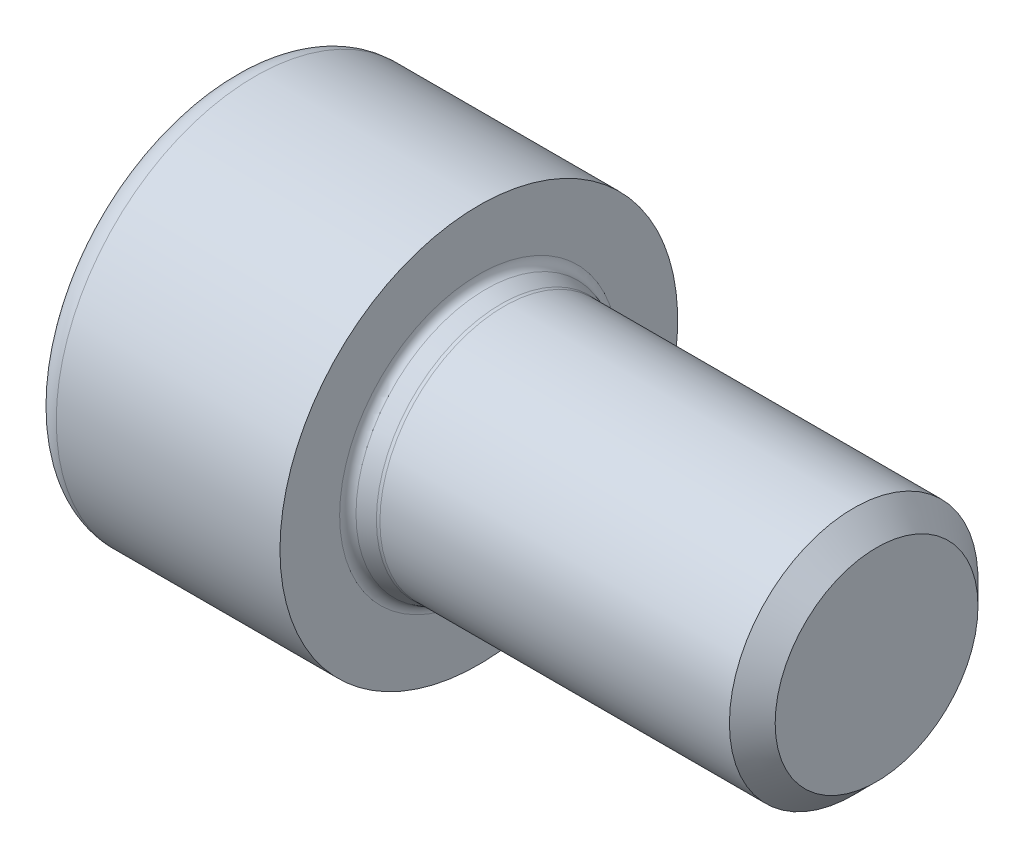
ISO-10303-21;
HEADER;
FILE_DESCRIPTION(('STEP AP214'),'2;1');
FILE_NAME('part.step','',(''),(''),'','','');
FILE_SCHEMA(('AUTOMOTIVE_DESIGN { 1 0 10303 214 1 1 1 1 }'));
ENDSEC;
DATA;
#1=APPLICATION_CONTEXT('core data for automotive mechanical design processes');
#2=APPLICATION_PROTOCOL_DEFINITION('international standard','automotive_design',2000,#1);
#3=PRODUCT_CONTEXT('',#1,'mechanical');
#4=PRODUCT('Part','Part','',(#3));
#5=PRODUCT_RELATED_PRODUCT_CATEGORY('part','',(#4));
#6=PRODUCT_DEFINITION_FORMATION('','',#4);
#7=PRODUCT_DEFINITION_CONTEXT('part definition',#1,'design');
#8=PRODUCT_DEFINITION('design','',#6,#7);
#9=PRODUCT_DEFINITION_SHAPE('','',#8);
#10=(LENGTH_UNIT() NAMED_UNIT(*) SI_UNIT(.MILLI.,.METRE.));
#11=(NAMED_UNIT(*) PLANE_ANGLE_UNIT() SI_UNIT($,.RADIAN.));
#12=(NAMED_UNIT(*) SI_UNIT($,.STERADIAN.) SOLID_ANGLE_UNIT());
#13=UNCERTAINTY_MEASURE_WITH_UNIT(LENGTH_MEASURE(1.E-05),#10,'distance_accuracy_value','');
#14=(GEOMETRIC_REPRESENTATION_CONTEXT(3) GLOBAL_UNCERTAINTY_ASSIGNED_CONTEXT((#13)) GLOBAL_UNIT_ASSIGNED_CONTEXT((#10,
#11,#12)) REPRESENTATION_CONTEXT('',''));
#15=CARTESIAN_POINT('',(0.,0.,0.));
#16=DIRECTION('',(0.,0.,1.));
#17=DIRECTION('',(1.,0.,0.));
#18=AXIS2_PLACEMENT_3D('',#15,#16,#17);
#19=CARTESIAN_POINT('',(-10.,4.,0.));
#20=DIRECTION('',(1.,0.,0.));
#21=DIRECTION('',(0.,0.,-1.));
#22=AXIS2_PLACEMENT_3D('',#19,#20,#21);
#23=PLANE('',#22);
#24=DIRECTION('',(0.,0.5,-0.866025403784439));
#25=VECTOR('',#24,1.);
#26=CARTESIAN_POINT('',(-10.,-2.46410161513776,-3.73205080756888));
#27=LINE('',#26,#25);
#28=CARTESIAN_POINT('',(-10.,-4.61880215351701,0.));
#29=VERTEX_POINT('',#28);
#30=CARTESIAN_POINT('',(-10.,-2.3094010767585,-4.));
#31=VERTEX_POINT('',#30);
#32=EDGE_CURVE('E250',#29,#31,#27,.T.);
#33=ORIENTED_EDGE('',*,*,#32,.T.);
#34=DIRECTION('',(0.,1.,0.));
#35=VECTOR('',#34,1.);
#36=CARTESIAN_POINT('',(-10.,4.,-4.));
#37=LINE('',#36,#35);
#38=CARTESIAN_POINT('',(-10.,2.3094010767585,-4.));
#39=VERTEX_POINT('',#38);
#40=EDGE_CURVE('E52',#31,#39,#37,.T.);
#41=ORIENTED_EDGE('',*,*,#40,.T.);
#42=DIRECTION('',(0.,0.5,0.866025403784439));
#43=VECTOR('',#42,1.);
#44=CARTESIAN_POINT('',(-10.,4.46410161513775,-0.267949192431123));
#45=LINE('',#44,#43);
#46=CARTESIAN_POINT('',(-10.,4.61880215351701,0.));
#47=VERTEX_POINT('',#46);
#48=EDGE_CURVE('E100',#39,#47,#45,.T.);
#49=ORIENTED_EDGE('',*,*,#48,.T.);
#50=DIRECTION('',(0.,-0.5,0.866025403784439));
#51=VECTOR('',#50,1.);
#52=CARTESIAN_POINT('',(-10.,4.46410161513775,0.267949192431123));
#53=LINE('',#52,#51);
#54=CARTESIAN_POINT('',(-10.,2.3094010767585,4.));
#55=VERTEX_POINT('',#54);
#56=EDGE_CURVE('E249',#47,#55,#53,.T.);
#57=ORIENTED_EDGE('',*,*,#56,.T.);
#58=DIRECTION('',(0.,-1.,0.));
#59=VECTOR('',#58,1.);
#60=CARTESIAN_POINT('',(-10.,4.,4.));
#61=LINE('',#60,#59);
#62=CARTESIAN_POINT('',(-10.,-2.3094010767585,4.));
#63=VERTEX_POINT('',#62);
#64=EDGE_CURVE('E182',#55,#63,#61,.T.);
#65=ORIENTED_EDGE('',*,*,#64,.T.);
#66=DIRECTION('',(0.,-0.5,-0.866025403784439));
#67=VECTOR('',#66,1.);
#68=CARTESIAN_POINT('',(-10.,-2.46410161513776,3.73205080756888));
#69=LINE('',#68,#67);
#70=EDGE_CURVE('E241',#63,#29,#69,.T.);
#71=ORIENTED_EDGE('',*,*,#70,.T.);
#72=EDGE_LOOP('',(#33,#41,#49,#57,#65,#71));
#73=FACE_BOUND('',#72,.T.);
#74=CARTESIAN_POINT('',(-10.,0.,0.));
#75=DIRECTION('',(-1.,0.,0.));
#76=DIRECTION('',(0.,0.,1.));
#77=AXIS2_PLACEMENT_3D('',#74,#75,#76);
#78=CIRCLE('',#77,6.99999999999999);
#79=CARTESIAN_POINT('',(-10.,0.,6.99999999999999));
#80=VERTEX_POINT('',#79);
#81=EDGE_CURVE('E240',#80,#80,#78,.T.);
#82=ORIENTED_EDGE('',*,*,#81,.T.);
#83=EDGE_LOOP('',(#82));
#84=FACE_BOUND('',#83,.T.);
#85=ADVANCED_FACE('F90',(#73,#84),#23,.F.);
#86=CARTESIAN_POINT('',(-8.99999999999999,0.,0.));
#87=DIRECTION('',(-1.,0.,0.));
#88=DIRECTION('',(0.,0.,1.));
#89=AXIS2_PLACEMENT_3D('',#86,#87,#88);
#90=TOROIDAL_SURFACE('',#89,6.99999999999999,1.00000000000001);
#91=ORIENTED_EDGE('',*,*,#81,.F.);
#92=EDGE_LOOP('',(#91));
#93=FACE_BOUND('',#92,.T.);
#94=CARTESIAN_POINT('',(-9.,0.,0.));
#95=DIRECTION('',(-1.,0.,0.));
#96=DIRECTION('',(0.,0.,1.));
#97=AXIS2_PLACEMENT_3D('',#94,#95,#96);
#98=CIRCLE('',#97,8.);
#99=CARTESIAN_POINT('',(-9.,0.,8.));
#100=VERTEX_POINT('',#99);
#101=EDGE_CURVE('E233',#100,#100,#98,.T.);
#102=ORIENTED_EDGE('',*,*,#101,.T.);
#103=EDGE_LOOP('',(#102));
#104=FACE_BOUND('',#103,.T.);
#105=ADVANCED_FACE('F302',(#93,#104),#90,.T.);
#106=CARTESIAN_POINT('',(16.,0.,0.));
#107=DIRECTION('',(-1.,0.,0.));
#108=DIRECTION('',(0.,0.,1.));
#109=AXIS2_PLACEMENT_3D('',#106,#107,#108);
#110=CYLINDRICAL_SURFACE('',#109,8.);
#111=ORIENTED_EDGE('',*,*,#101,.F.);
#112=EDGE_LOOP('',(#111));
#113=FACE_BOUND('',#112,.T.);
#114=CARTESIAN_POINT('',(0.,0.,0.));
#115=DIRECTION('',(-1.,0.,0.));
#116=DIRECTION('',(0.,0.,1.));
#117=AXIS2_PLACEMENT_3D('',#114,#115,#116);
#118=CIRCLE('',#117,8.);
#119=CARTESIAN_POINT('',(0.,0.,8.));
#120=VERTEX_POINT('',#119);
#121=EDGE_CURVE('E234',#120,#120,#118,.T.);
#122=ORIENTED_EDGE('',*,*,#121,.T.);
#123=EDGE_LOOP('',(#122));
#124=FACE_BOUND('',#123,.T.);
#125=ADVANCED_FACE('F313',(#113,#124),#110,.T.);
#126=CARTESIAN_POINT('',(0.,8.,0.));
#127=DIRECTION('',(-1.,0.,0.));
#128=DIRECTION('',(0.,0.,1.));
#129=AXIS2_PLACEMENT_3D('',#126,#127,#128);
#130=PLANE('',#129);
#131=ORIENTED_EDGE('',*,*,#121,.F.);
#132=EDGE_LOOP('',(#131));
#133=FACE_BOUND('',#132,.T.);
#134=CARTESIAN_POINT('',(0.,0.,0.));
#135=DIRECTION('',(-1.,0.,0.));
#136=DIRECTION('',(0.,0.,1.));
#137=AXIS2_PLACEMENT_3D('',#134,#135,#136);
#138=CIRCLE('',#137,5.6);
#139=CARTESIAN_POINT('',(0.,0.,5.6));
#140=VERTEX_POINT('',#139);
#141=EDGE_CURVE('E229',#140,#140,#138,.T.);
#142=ORIENTED_EDGE('',*,*,#141,.T.);
#143=EDGE_LOOP('',(#142));
#144=FACE_BOUND('',#143,.T.);
#145=ADVANCED_FACE('F320',(#133,#144),#130,.F.);
#146=CARTESIAN_POINT('',(0.399999999999996,0.,0.));
#147=DIRECTION('',(-1.,0.,0.));
#148=DIRECTION('',(0.,0.,1.));
#149=AXIS2_PLACEMENT_3D('',#146,#147,#148);
#150=TOROIDAL_SURFACE('',#149,5.6,0.399999999999996);
#151=ORIENTED_EDGE('',*,*,#141,.F.);
#152=EDGE_LOOP('',(#151));
#153=FACE_BOUND('',#152,.T.);
#154=CARTESIAN_POINT('',(0.277198888030895,0.,0.));
#155=DIRECTION('',(-1.,0.,0.));
#156=DIRECTION('',(0.,0.,1.));
#157=AXIS2_PLACEMENT_3D('',#154,#155,#156);
#158=CIRCLE('',#157,5.21931655289578);
#159=CARTESIAN_POINT('',(0.277198888030895,0.,5.21931655289578));
#160=VERTEX_POINT('',#159);
#161=EDGE_CURVE('E223',#160,#160,#158,.T.);
#162=ORIENTED_EDGE('',*,*,#161,.T.);
#163=EDGE_LOOP('',(#162));
#164=FACE_BOUND('',#163,.T.);
#165=ADVANCED_FACE('F319',(#153,#164),#150,.F.);
#166=CARTESIAN_POINT('',(0.897198888030895,0.,0.));
#167=DIRECTION('',(-1.,0.,0.));
#168=DIRECTION('',(0.,0.,1.));
#169=AXIS2_PLACEMENT_3D('',#166,#167,#168);
#170=CONICAL_SURFACE('',#169,5.01931655289578,0.312042121562535);
#171=ORIENTED_EDGE('',*,*,#161,.F.);
#172=EDGE_LOOP('',(#171));
#173=FACE_BOUND('',#172,.T.);
#174=CARTESIAN_POINT('',(0.897198888030895,0.,0.));
#175=DIRECTION('',(-1.,0.,0.));
#176=DIRECTION('',(0.,0.,1.));
#177=AXIS2_PLACEMENT_3D('',#174,#175,#176);
#178=CIRCLE('',#177,5.01931655289578);
#179=CARTESIAN_POINT('',(0.897198888030895,0.,5.01931655289578));
#180=VERTEX_POINT('',#179);
#181=EDGE_CURVE('E225',#180,#180,#178,.T.);
#182=ORIENTED_EDGE('',*,*,#181,.T.);
#183=EDGE_LOOP('',(#182));
#184=FACE_BOUND('',#183,.T.);
#185=ADVANCED_FACE('F322',(#173,#184),#170,.T.);
#186=CARTESIAN_POINT('',(1.01999999999999,0.,0.));
#187=DIRECTION('',(-1.,0.,0.));
#188=DIRECTION('',(0.,0.,1.));
#189=AXIS2_PLACEMENT_3D('',#186,#187,#188);
#190=TOROIDAL_SURFACE('',#189,5.39999999999996,0.399999999999959);
#191=ORIENTED_EDGE('',*,*,#181,.F.);
#192=EDGE_LOOP('',(#191));
#193=FACE_BOUND('',#192,.T.);
#194=CARTESIAN_POINT('',(1.02,0.,0.));
#195=DIRECTION('',(-1.,0.,0.));
#196=DIRECTION('',(0.,0.,1.));
#197=AXIS2_PLACEMENT_3D('',#194,#195,#196);
#198=CIRCLE('',#197,5.);
#199=CARTESIAN_POINT('',(1.02,0.,5.));
#200=VERTEX_POINT('',#199);
#201=EDGE_CURVE('E218',#200,#200,#198,.T.);
#202=ORIENTED_EDGE('',*,*,#201,.T.);
#203=EDGE_LOOP('',(#202));
#204=FACE_BOUND('',#203,.T.);
#205=ADVANCED_FACE('F327',(#193,#204),#190,.F.);
#206=CARTESIAN_POINT('',(16.,0.,0.));
#207=DIRECTION('',(-1.,0.,0.));
#208=DIRECTION('',(0.,0.,1.));
#209=AXIS2_PLACEMENT_3D('',#206,#207,#208);
#210=CYLINDRICAL_SURFACE('',#209,5.);
#211=ORIENTED_EDGE('',*,*,#201,.F.);
#212=EDGE_LOOP('',(#211));
#213=FACE_BOUND('',#212,.T.);
#214=CARTESIAN_POINT('',(15.08,0.,0.));
#215=DIRECTION('',(-1.,0.,0.));
#216=DIRECTION('',(0.,0.,1.));
#217=AXIS2_PLACEMENT_3D('',#214,#215,#216);
#218=CIRCLE('',#217,5.);
#219=CARTESIAN_POINT('',(15.08,0.,5.));
#220=VERTEX_POINT('',#219);
#221=EDGE_CURVE('E216',#220,#220,#218,.T.);
#222=ORIENTED_EDGE('',*,*,#221,.T.);
#223=EDGE_LOOP('',(#222));
#224=FACE_BOUND('',#223,.T.);
#225=ADVANCED_FACE('F332',(#213,#224),#210,.T.);
#226=CARTESIAN_POINT('',(16.,0.,0.));
#227=DIRECTION('',(-1.,0.,0.));
#228=DIRECTION('',(0.,0.,1.));
#229=AXIS2_PLACEMENT_3D('',#226,#227,#228);
#230=CONICAL_SURFACE('',#229,4.08,0.785398163397448);
#231=ORIENTED_EDGE('',*,*,#221,.F.);
#232=EDGE_LOOP('',(#231));
#233=FACE_BOUND('',#232,.T.);
#234=CARTESIAN_POINT('',(16.,0.,0.));
#235=DIRECTION('',(-1.,0.,0.));
#236=DIRECTION('',(0.,0.,1.));
#237=AXIS2_PLACEMENT_3D('',#234,#235,#236);
#238=CIRCLE('',#237,4.08);
#239=CARTESIAN_POINT('',(16.,0.,4.08));
#240=VERTEX_POINT('',#239);
#241=EDGE_CURVE('E206',#240,#240,#238,.T.);
#242=ORIENTED_EDGE('',*,*,#241,.T.);
#243=EDGE_LOOP('',(#242));
#244=FACE_BOUND('',#243,.T.);
#245=ADVANCED_FACE('F299',(#233,#244),#230,.T.);
#246=CARTESIAN_POINT('',(16.,4.08,0.));
#247=DIRECTION('',(-1.,0.,0.));
#248=DIRECTION('',(0.,0.,1.));
#249=AXIS2_PLACEMENT_3D('',#246,#247,#248);
#250=PLANE('',#249);
#251=ORIENTED_EDGE('',*,*,#241,.F.);
#252=EDGE_LOOP('',(#251));
#253=FACE_BOUND('',#252,.T.);
#254=ADVANCED_FACE('F295',(#253),#250,.F.);
#255=CARTESIAN_POINT('',(-4.,0.,0.));
#256=DIRECTION('',(1.,0.,0.));
#257=DIRECTION('',(0.,0.,-1.));
#258=AXIS2_PLACEMENT_3D('',#255,#256,#257);
#259=PLANE('',#258);
#260=DIRECTION('',(0.,1.,0.));
#261=VECTOR('',#260,1.);
#262=CARTESIAN_POINT('',(-4.,-2.3094010767585,-4.));
#263=LINE('',#262,#261);
#264=CARTESIAN_POINT('',(-4.,-2.3094010767585,-4.));
#265=VERTEX_POINT('',#264);
#266=CARTESIAN_POINT('',(-4.,0.,-4.));
#267=VERTEX_POINT('',#266);
#268=EDGE_CURVE('E102',#265,#267,#263,.T.);
#269=ORIENTED_EDGE('',*,*,#268,.F.);
#270=DIRECTION('',(0.,0.5,-0.866025403784439));
#271=VECTOR('',#270,1.);
#272=CARTESIAN_POINT('',(-4.,-4.61880215351701,0.));
#273=LINE('',#272,#271);
#274=CARTESIAN_POINT('',(-4.,-3.46410161513775,-2.));
#275=VERTEX_POINT('',#274);
#276=EDGE_CURVE('E192',#275,#265,#273,.T.);
#277=ORIENTED_EDGE('',*,*,#276,.F.);
#278=CARTESIAN_POINT('',(-4.,0.,0.));
#279=DIRECTION('',(-1.,0.,0.));
#280=DIRECTION('',(0.,0.,1.));
#281=AXIS2_PLACEMENT_3D('',#278,#279,#280);
#282=CIRCLE('',#281,4.);
#283=EDGE_CURVE('E269',#267,#275,#282,.T.);
#284=ORIENTED_EDGE('',*,*,#283,.F.);
#285=EDGE_LOOP('',(#269,#277,#284));
#286=FACE_BOUND('',#285,.T.);
#287=ADVANCED_FACE('F287',(#286),#259,.F.);
#288=CARTESIAN_POINT('',(-4.,-4.61880215351701,0.));
#289=VERTEX_POINT('',#288);
#290=EDGE_CURVE('E198',#289,#275,#273,.T.);
#291=ORIENTED_EDGE('',*,*,#290,.F.);
#292=DIRECTION('',(0.,-0.5,-0.866025403784439));
#293=VECTOR('',#292,1.);
#294=CARTESIAN_POINT('',(-4.,-2.3094010767585,4.));
#295=LINE('',#294,#293);
#296=CARTESIAN_POINT('',(-4.,-3.46410161513775,2.));
#297=VERTEX_POINT('',#296);
#298=EDGE_CURVE('E190',#297,#289,#295,.T.);
#299=ORIENTED_EDGE('',*,*,#298,.F.);
#300=EDGE_CURVE('E271',#275,#297,#282,.T.);
#301=ORIENTED_EDGE('',*,*,#300,.F.);
#302=EDGE_LOOP('',(#291,#299,#301));
#303=FACE_BOUND('',#302,.T.);
#304=ADVANCED_FACE('F276',(#303),#259,.F.);
#305=CARTESIAN_POINT('',(-4.,-2.3094010767585,4.));
#306=VERTEX_POINT('',#305);
#307=EDGE_CURVE('E194',#306,#297,#295,.T.);
#308=ORIENTED_EDGE('',*,*,#307,.F.);
#309=DIRECTION('',(0.,-1.,0.));
#310=VECTOR('',#309,1.);
#311=CARTESIAN_POINT('',(-4.,2.3094010767585,4.));
#312=LINE('',#311,#310);
#313=CARTESIAN_POINT('',(-4.,0.,4.));
#314=VERTEX_POINT('',#313);
#315=EDGE_CURVE('E189',#314,#306,#312,.T.);
#316=ORIENTED_EDGE('',*,*,#315,.F.);
#317=EDGE_CURVE('E238',#297,#314,#282,.T.);
#318=ORIENTED_EDGE('',*,*,#317,.F.);
#319=EDGE_LOOP('',(#308,#316,#318));
#320=FACE_BOUND('',#319,.T.);
#321=ADVANCED_FACE('F277',(#320),#259,.F.);
#322=CARTESIAN_POINT('',(-4.,2.3094010767585,4.));
#323=VERTEX_POINT('',#322);
#324=EDGE_CURVE('E180',#323,#314,#312,.T.);
#325=ORIENTED_EDGE('',*,*,#324,.F.);
#326=DIRECTION('',(0.,-0.5,0.866025403784439));
#327=VECTOR('',#326,1.);
#328=CARTESIAN_POINT('',(-4.,4.61880215351701,0.));
#329=LINE('',#328,#327);
#330=CARTESIAN_POINT('',(-4.,3.46410161513775,2.));
#331=VERTEX_POINT('',#330);
#332=EDGE_CURVE('E164',#331,#323,#329,.T.);
#333=ORIENTED_EDGE('',*,*,#332,.F.);
#334=EDGE_CURVE('E183',#314,#331,#282,.T.);
#335=ORIENTED_EDGE('',*,*,#334,.F.);
#336=EDGE_LOOP('',(#325,#333,#335));
#337=FACE_BOUND('',#336,.T.);
#338=ADVANCED_FACE('F184',(#337),#259,.F.);
#339=CARTESIAN_POINT('',(-4.,4.61880215351701,0.));
#340=VERTEX_POINT('',#339);
#341=EDGE_CURVE('E172',#340,#331,#329,.T.);
#342=ORIENTED_EDGE('',*,*,#341,.F.);
#343=DIRECTION('',(0.,0.5,0.866025403784439));
#344=VECTOR('',#343,1.);
#345=CARTESIAN_POINT('',(-4.,2.3094010767585,-4.));
#346=LINE('',#345,#344);
#347=CARTESIAN_POINT('',(-4.,3.46410161513775,-2.));
#348=VERTEX_POINT('',#347);
#349=EDGE_CURVE('E203',#348,#340,#346,.T.);
#350=ORIENTED_EDGE('',*,*,#349,.F.);
#351=EDGE_CURVE('E245',#331,#348,#282,.T.);
#352=ORIENTED_EDGE('',*,*,#351,.F.);
#353=EDGE_LOOP('',(#342,#350,#352));
#354=FACE_BOUND('',#353,.T.);
#355=ADVANCED_FACE('F305',(#354),#259,.F.);
#356=CARTESIAN_POINT('',(-4.,2.3094010767585,-4.));
#357=VERTEX_POINT('',#356);
#358=EDGE_CURVE('E185',#357,#348,#346,.T.);
#359=ORIENTED_EDGE('',*,*,#358,.F.);
#360=EDGE_CURVE('E200',#267,#357,#263,.T.);
#361=ORIENTED_EDGE('',*,*,#360,.F.);
#362=EDGE_CURVE('E262',#348,#267,#282,.T.);
#363=ORIENTED_EDGE('',*,*,#362,.F.);
#364=EDGE_LOOP('',(#359,#361,#363));
#365=FACE_BOUND('',#364,.T.);
#366=ADVANCED_FACE('F265',(#365),#259,.F.);
#367=CARTESIAN_POINT('',(-14.,4.61880215351701,0.));
#368=DIRECTION('',(0.,0.866025403784439,0.5));
#369=DIRECTION('',(0.,-0.5,0.866025403784439));
#370=AXIS2_PLACEMENT_3D('',#367,#368,#369);
#371=PLANE('',#370);
#372=ORIENTED_EDGE('',*,*,#56,.F.);
#373=DIRECTION('',(1.,0.,0.));
#374=VECTOR('',#373,1.);
#375=CARTESIAN_POINT('',(-14.,4.61880215351701,0.));
#376=LINE('',#375,#374);
#377=EDGE_CURVE('E204',#47,#340,#376,.T.);
#378=ORIENTED_EDGE('',*,*,#377,.T.);
#379=ORIENTED_EDGE('',*,*,#341,.T.);
#380=ORIENTED_EDGE('',*,*,#332,.T.);
#381=DIRECTION('',(1.,0.,0.));
#382=VECTOR('',#381,1.);
#383=CARTESIAN_POINT('',(-14.,2.3094010767585,4.));
#384=LINE('',#383,#382);
#385=EDGE_CURVE('E169',#55,#323,#384,.T.);
#386=ORIENTED_EDGE('',*,*,#385,.F.);
#387=EDGE_LOOP('',(#372,#378,#379,#380,#386));
#388=FACE_BOUND('',#387,.T.);
#389=ADVANCED_FACE('F170',(#388),#371,.F.);
#390=CARTESIAN_POINT('',(-14.,2.3094010767585,-4.));
#391=DIRECTION('',(0.,0.866025403784439,-0.5));
#392=DIRECTION('',(0.,0.5,0.866025403784439));
#393=AXIS2_PLACEMENT_3D('',#390,#391,#392);
#394=PLANE('',#393);
#395=ORIENTED_EDGE('',*,*,#48,.F.);
#396=DIRECTION('',(1.,0.,0.));
#397=VECTOR('',#396,1.);
#398=CARTESIAN_POINT('',(-14.,2.3094010767585,-4.));
#399=LINE('',#398,#397);
#400=EDGE_CURVE('E210',#39,#357,#399,.T.);
#401=ORIENTED_EDGE('',*,*,#400,.T.);
#402=ORIENTED_EDGE('',*,*,#358,.T.);
#403=ORIENTED_EDGE('',*,*,#349,.T.);
#404=ORIENTED_EDGE('',*,*,#377,.F.);
#405=EDGE_LOOP('',(#395,#401,#402,#403,#404));
#406=FACE_BOUND('',#405,.T.);
#407=ADVANCED_FACE('F258',(#406),#394,.F.);
#408=CARTESIAN_POINT('',(-14.,-2.3094010767585,-4.));
#409=DIRECTION('',(0.,0.,-1.));
#410=DIRECTION('',(-1.,0.,0.));
#411=AXIS2_PLACEMENT_3D('',#408,#409,#410);
#412=PLANE('',#411);
#413=ORIENTED_EDGE('',*,*,#40,.F.);
#414=DIRECTION('',(1.,0.,0.));
#415=VECTOR('',#414,1.);
#416=CARTESIAN_POINT('',(-14.,-2.3094010767585,-4.));
#417=LINE('',#416,#415);
#418=EDGE_CURVE('E207',#31,#265,#417,.T.);
#419=ORIENTED_EDGE('',*,*,#418,.T.);
#420=ORIENTED_EDGE('',*,*,#268,.T.);
#421=ORIENTED_EDGE('',*,*,#360,.T.);
#422=ORIENTED_EDGE('',*,*,#400,.F.);
#423=EDGE_LOOP('',(#413,#419,#420,#421,#422));
#424=FACE_BOUND('',#423,.T.);
#425=ADVANCED_FACE('F256',(#424),#412,.F.);
#426=CARTESIAN_POINT('',(-14.,-4.61880215351701,0.));
#427=DIRECTION('',(0.,-0.866025403784439,-0.5));
#428=DIRECTION('',(0.,0.5,-0.866025403784439));
#429=AXIS2_PLACEMENT_3D('',#426,#427,#428);
#430=PLANE('',#429);
#431=ORIENTED_EDGE('',*,*,#32,.F.);
#432=DIRECTION('',(1.,0.,0.));
#433=VECTOR('',#432,1.);
#434=CARTESIAN_POINT('',(-14.,-4.61880215351701,0.));
#435=LINE('',#434,#433);
#436=EDGE_CURVE('E211',#29,#289,#435,.T.);
#437=ORIENTED_EDGE('',*,*,#436,.T.);
#438=ORIENTED_EDGE('',*,*,#290,.T.);
#439=ORIENTED_EDGE('',*,*,#276,.T.);
#440=ORIENTED_EDGE('',*,*,#418,.F.);
#441=EDGE_LOOP('',(#431,#437,#438,#439,#440));
#442=FACE_BOUND('',#441,.T.);
#443=ADVANCED_FACE('F286',(#442),#430,.F.);
#444=CARTESIAN_POINT('',(-14.,-2.3094010767585,4.));
#445=DIRECTION('',(0.,-0.866025403784439,0.5));
#446=DIRECTION('',(0.,-0.5,-0.866025403784439));
#447=AXIS2_PLACEMENT_3D('',#444,#445,#446);
#448=PLANE('',#447);
#449=ORIENTED_EDGE('',*,*,#70,.F.);
#450=DIRECTION('',(1.,0.,0.));
#451=VECTOR('',#450,1.);
#452=CARTESIAN_POINT('',(-14.,-2.3094010767585,4.));
#453=LINE('',#452,#451);
#454=EDGE_CURVE('E115',#63,#306,#453,.T.);
#455=ORIENTED_EDGE('',*,*,#454,.T.);
#456=ORIENTED_EDGE('',*,*,#307,.T.);
#457=ORIENTED_EDGE('',*,*,#298,.T.);
#458=ORIENTED_EDGE('',*,*,#436,.F.);
#459=EDGE_LOOP('',(#449,#455,#456,#457,#458));
#460=FACE_BOUND('',#459,.T.);
#461=ADVANCED_FACE('F284',(#460),#448,.F.);
#462=CARTESIAN_POINT('',(-14.,2.3094010767585,4.));
#463=DIRECTION('',(0.,0.,1.));
#464=DIRECTION('',(1.,0.,0.));
#465=AXIS2_PLACEMENT_3D('',#462,#463,#464);
#466=PLANE('',#465);
#467=ORIENTED_EDGE('',*,*,#64,.F.);
#468=ORIENTED_EDGE('',*,*,#385,.T.);
#469=ORIENTED_EDGE('',*,*,#324,.T.);
#470=ORIENTED_EDGE('',*,*,#315,.T.);
#471=ORIENTED_EDGE('',*,*,#454,.F.);
#472=EDGE_LOOP('',(#467,#468,#469,#470,#471));
#473=FACE_BOUND('',#472,.T.);
#474=ADVANCED_FACE('F176',(#473),#466,.F.);
#475=CARTESIAN_POINT('',(-4.,0.,0.));
#476=DIRECTION('',(-1.,0.,0.));
#477=DIRECTION('',(0.,0.,1.));
#478=AXIS2_PLACEMENT_3D('',#475,#476,#477);
#479=CONICAL_SURFACE('',#478,4.,1.0471975511966);
#480=CARTESIAN_POINT('',(-1.6905989232415,0.,0.));
#481=VERTEX_POINT('',#480);
#482=VERTEX_LOOP('',#481);
#483=FACE_BOUND('',#482,.T.);
#484=ORIENTED_EDGE('',*,*,#334,.T.);
#485=ORIENTED_EDGE('',*,*,#351,.T.);
#486=ORIENTED_EDGE('',*,*,#362,.T.);
#487=ORIENTED_EDGE('',*,*,#283,.T.);
#488=ORIENTED_EDGE('',*,*,#300,.T.);
#489=ORIENTED_EDGE('',*,*,#317,.T.);
#490=EDGE_LOOP('',(#484,#485,#486,#487,#488,#489));
#491=FACE_BOUND('',#490,.T.);
#492=ADVANCED_FACE('F93',(#483,#491),#479,.F.);
#493=CLOSED_SHELL('',(#85,#105,#125,#145,#165,#185,#205,#225,#245,#254,#287,#304,#321,#338,#355,
#366,#389,#407,#425,#443,#461,#474,#492));
#494=MANIFOLD_SOLID_BREP('B6',#493);
#495=ADVANCED_BREP_SHAPE_REPRESENTATION('',(#18,#494),#14);
#496=SHAPE_DEFINITION_REPRESENTATION(#9,#495);
ENDSEC;
END-ISO-10303-21;
